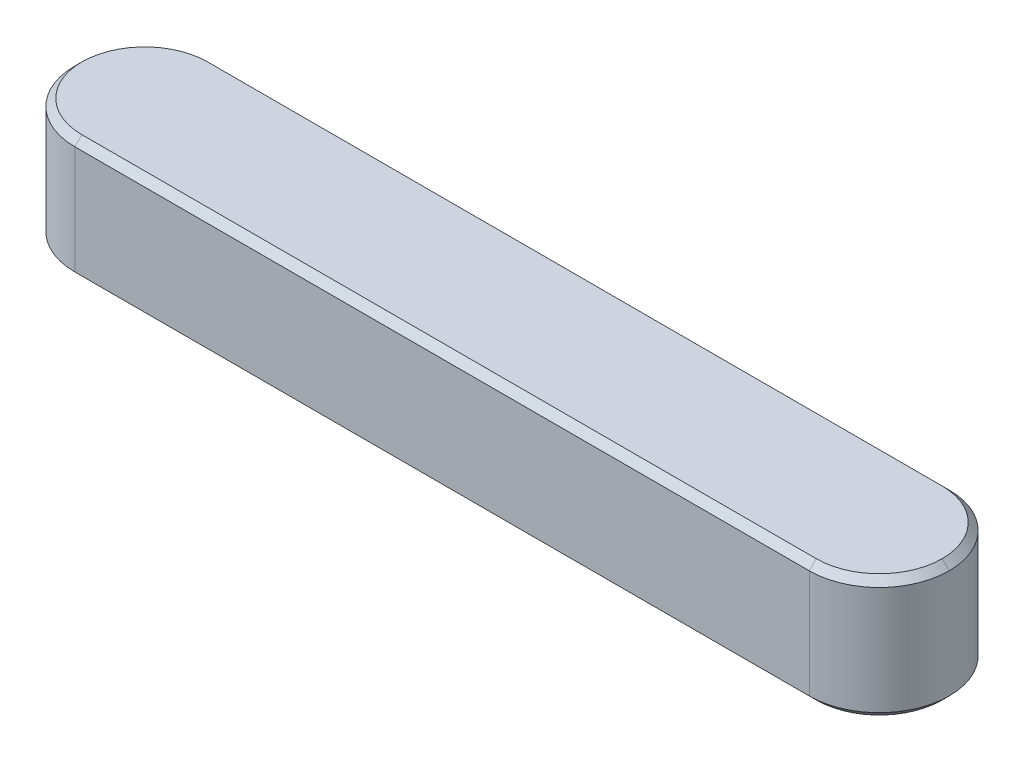
ISO-10303-21;
HEADER;
FILE_DESCRIPTION(('STEP AP214'),'2;1');
FILE_NAME('part.step','',(''),(''),'','','');
FILE_SCHEMA(('AUTOMOTIVE_DESIGN { 1 0 10303 214 1 1 1 1 }'));
ENDSEC;
DATA;
#1=APPLICATION_CONTEXT('core data for automotive mechanical design processes');
#2=APPLICATION_PROTOCOL_DEFINITION('international standard','automotive_design',2000,#1);
#3=PRODUCT_CONTEXT('',#1,'mechanical');
#4=PRODUCT('Part','Part','',(#3));
#5=PRODUCT_RELATED_PRODUCT_CATEGORY('part','',(#4));
#6=PRODUCT_DEFINITION_FORMATION('','',#4);
#7=PRODUCT_DEFINITION_CONTEXT('part definition',#1,'design');
#8=PRODUCT_DEFINITION('design','',#6,#7);
#9=PRODUCT_DEFINITION_SHAPE('','',#8);
#10=(LENGTH_UNIT() NAMED_UNIT(*) SI_UNIT(.MILLI.,.METRE.));
#11=(NAMED_UNIT(*) PLANE_ANGLE_UNIT() SI_UNIT($,.RADIAN.));
#12=(NAMED_UNIT(*) SI_UNIT($,.STERADIAN.) SOLID_ANGLE_UNIT());
#13=UNCERTAINTY_MEASURE_WITH_UNIT(LENGTH_MEASURE(1.E-05),#10,'distance_accuracy_value','');
#14=(GEOMETRIC_REPRESENTATION_CONTEXT(3) GLOBAL_UNCERTAINTY_ASSIGNED_CONTEXT((#13)) GLOBAL_UNIT_ASSIGNED_CONTEXT((#10,
#11,#12)) REPRESENTATION_CONTEXT('',''));
#15=CARTESIAN_POINT('',(0.,0.,0.));
#16=DIRECTION('',(0.,0.,1.));
#17=DIRECTION('',(1.,0.,0.));
#18=AXIS2_PLACEMENT_3D('',#15,#16,#17);
#19=CARTESIAN_POINT('',(149.000005082878,10.,-3.6));
#20=DIRECTION('',(0.,0.707106781186548,0.707106781186548));
#21=DIRECTION('',(-1.,0.,0.));
#22=AXIS2_PLACEMENT_3D('',#19,#20,#21);
#23=PLANE('',#22);
#24=DIRECTION('',(0.,0.707106781186548,-0.707106781186548));
#25=VECTOR('',#24,1.);
#26=CARTESIAN_POINT('',(149.000005082878,10.,-3.6));
#27=LINE('',#26,#25);
#28=CARTESIAN_POINT('',(149.000005082878,10.,-3.6));
#29=VERTEX_POINT('',#28);
#30=CARTESIAN_POINT('',(149.000005082878,10.4,-4.));
#31=VERTEX_POINT('',#30);
#32=EDGE_CURVE('E151',#29,#31,#27,.T.);
#33=ORIENTED_EDGE('',*,*,#32,.T.);
#34=DIRECTION('',(-1.,0.,0.));
#35=VECTOR('',#34,1.);
#36=CARTESIAN_POINT('',(191.000005082878,10.4,-4.));
#37=LINE('',#36,#35);
#38=CARTESIAN_POINT('',(191.000005082878,10.4,-4.));
#39=VERTEX_POINT('',#38);
#40=EDGE_CURVE('E203',#39,#31,#37,.T.);
#41=ORIENTED_EDGE('',*,*,#40,.F.);
#42=DIRECTION('',(0.,-0.707106781186548,0.707106781186548));
#43=VECTOR('',#42,1.);
#44=CARTESIAN_POINT('',(191.000005082878,10.4,-4.));
#45=LINE('',#44,#43);
#46=CARTESIAN_POINT('',(191.000005082878,10.,-3.6));
#47=VERTEX_POINT('',#46);
#48=EDGE_CURVE('E11',#39,#47,#45,.T.);
#49=ORIENTED_EDGE('',*,*,#48,.T.);
#50=DIRECTION('',(1.,0.,0.));
#51=VECTOR('',#50,1.);
#52=CARTESIAN_POINT('',(149.000005082878,10.,-3.6));
#53=LINE('',#52,#51);
#54=EDGE_CURVE('E134',#29,#47,#53,.T.);
#55=ORIENTED_EDGE('',*,*,#54,.F.);
#56=EDGE_LOOP('',(#33,#41,#49,#55));
#57=FACE_BOUND('',#56,.T.);
#58=ADVANCED_FACE('F17',(#57),#23,.F.);
#59=CARTESIAN_POINT('',(191.000005082878,10.,0.));
#60=DIRECTION('',(0.,1.,0.));
#61=DIRECTION('',(-1.,0.,0.));
#62=AXIS2_PLACEMENT_3D('',#59,#60,#61);
#63=CONICAL_SURFACE('',#62,3.6,0.785398163397448);
#64=DIRECTION('',(0.,-0.707106781186548,-0.707106781186548));
#65=VECTOR('',#64,1.);
#66=CARTESIAN_POINT('',(191.000005082878,10.4,4.));
#67=LINE('',#66,#65);
#68=CARTESIAN_POINT('',(191.000005082878,10.4,4.));
#69=VERTEX_POINT('',#68);
#70=CARTESIAN_POINT('',(191.000005082878,10.,3.6));
#71=VERTEX_POINT('',#70);
#72=EDGE_CURVE('E166',#69,#71,#67,.T.);
#73=ORIENTED_EDGE('',*,*,#72,.T.);
#74=CARTESIAN_POINT('',(191.000005082878,10.,0.));
#75=DIRECTION('',(0.,-1.,0.));
#76=DIRECTION('',(-1.,0.,0.));
#77=AXIS2_PLACEMENT_3D('',#74,#75,#76);
#78=CIRCLE('',#77,3.6);
#79=EDGE_CURVE('E232',#47,#71,#78,.T.);
#80=ORIENTED_EDGE('',*,*,#79,.F.);
#81=ORIENTED_EDGE('',*,*,#48,.F.);
#82=CARTESIAN_POINT('',(191.000005082878,10.4,0.));
#83=DIRECTION('',(0.,1.,0.));
#84=DIRECTION('',(-1.,0.,0.));
#85=AXIS2_PLACEMENT_3D('',#82,#83,#84);
#86=CIRCLE('',#85,4.);
#87=EDGE_CURVE('E215',#69,#39,#86,.T.);
#88=ORIENTED_EDGE('',*,*,#87,.F.);
#89=EDGE_LOOP('',(#73,#80,#81,#88));
#90=FACE_BOUND('',#89,.T.);
#91=ADVANCED_FACE('F280',(#90),#63,.T.);
#92=CARTESIAN_POINT('',(149.000005082878,10.,0.));
#93=DIRECTION('',(0.,1.,0.));
#94=DIRECTION('',(-1.,0.,0.));
#95=AXIS2_PLACEMENT_3D('',#92,#93,#94);
#96=CONICAL_SURFACE('',#95,3.6,0.785398163397448);
#97=DIRECTION('',(-0.707106781186548,0.707106781186548,0.));
#98=VECTOR('',#97,1.);
#99=CARTESIAN_POINT('',(145.400005082878,10.,0.));
#100=LINE('',#99,#98);
#101=CARTESIAN_POINT('',(145.400005082878,10.,0.));
#102=VERTEX_POINT('',#101);
#103=CARTESIAN_POINT('',(145.000005082878,10.4,0.));
#104=VERTEX_POINT('',#103);
#105=EDGE_CURVE('E138',#102,#104,#100,.T.);
#106=ORIENTED_EDGE('',*,*,#105,.F.);
#107=CARTESIAN_POINT('',(149.000005082878,10.,0.));
#108=DIRECTION('',(0.,-1.,0.));
#109=DIRECTION('',(-1.,0.,0.));
#110=AXIS2_PLACEMENT_3D('',#107,#108,#109);
#111=CIRCLE('',#110,3.6);
#112=CARTESIAN_POINT('',(149.000005082878,10.,3.6));
#113=VERTEX_POINT('',#112);
#114=EDGE_CURVE('E123',#113,#102,#111,.T.);
#115=ORIENTED_EDGE('',*,*,#114,.F.);
#116=DIRECTION('',(0.,0.707106781186548,0.707106781186548));
#117=VECTOR('',#116,1.);
#118=CARTESIAN_POINT('',(149.000005082878,10.,3.6));
#119=LINE('',#118,#117);
#120=CARTESIAN_POINT('',(149.000005082878,10.4,4.));
#121=VERTEX_POINT('',#120);
#122=EDGE_CURVE('E25',#113,#121,#119,.T.);
#123=ORIENTED_EDGE('',*,*,#122,.T.);
#124=CARTESIAN_POINT('',(149.000005082878,10.4,0.));
#125=DIRECTION('',(0.,1.,0.));
#126=DIRECTION('',(-1.,0.,0.));
#127=AXIS2_PLACEMENT_3D('',#124,#125,#126);
#128=CIRCLE('',#127,4.);
#129=EDGE_CURVE('E141',#104,#121,#128,.T.);
#130=ORIENTED_EDGE('',*,*,#129,.F.);
#131=EDGE_LOOP('',(#106,#115,#123,#130));
#132=FACE_BOUND('',#131,.T.);
#133=ADVANCED_FACE('F139',(#132),#96,.T.);
#134=CARTESIAN_POINT('',(149.000005082878,10.,3.6));
#135=DIRECTION('',(0.,0.707106781186548,-0.707106781186548));
#136=DIRECTION('',(0.,-0.707106781186548,-0.707106781186548));
#137=AXIS2_PLACEMENT_3D('',#134,#135,#136);
#138=PLANE('',#137);
#139=ORIENTED_EDGE('',*,*,#72,.F.);
#140=DIRECTION('',(1.,0.,0.));
#141=VECTOR('',#140,1.);
#142=CARTESIAN_POINT('',(149.000005082878,10.4,4.));
#143=LINE('',#142,#141);
#144=EDGE_CURVE('E223',#121,#69,#143,.T.);
#145=ORIENTED_EDGE('',*,*,#144,.F.);
#146=ORIENTED_EDGE('',*,*,#122,.F.);
#147=DIRECTION('',(-1.,0.,0.));
#148=VECTOR('',#147,1.);
#149=CARTESIAN_POINT('',(149.000005082878,10.,3.6));
#150=LINE('',#149,#148);
#151=EDGE_CURVE('E131',#71,#113,#150,.T.);
#152=ORIENTED_EDGE('',*,*,#151,.F.);
#153=EDGE_LOOP('',(#139,#145,#146,#152));
#154=FACE_BOUND('',#153,.T.);
#155=ADVANCED_FACE('F263',(#154),#138,.F.);
#156=CARTESIAN_POINT('',(191.000005082878,16.6,-4.));
#157=DIRECTION('',(0.,0.707106781186554,-0.707106781186542));
#158=DIRECTION('',(0.,-0.707106781186542,-0.707106781186554));
#159=AXIS2_PLACEMENT_3D('',#156,#157,#158);
#160=PLANE('',#159);
#161=DIRECTION('',(0.,0.707106781186548,0.707106781186548));
#162=VECTOR('',#161,1.);
#163=CARTESIAN_POINT('',(149.000005082878,16.6,-4.));
#164=LINE('',#163,#162);
#165=CARTESIAN_POINT('',(149.000005082878,16.6,-4.));
#166=VERTEX_POINT('',#165);
#167=CARTESIAN_POINT('',(149.000005082878,17.,-3.6));
#168=VERTEX_POINT('',#167);
#169=EDGE_CURVE('E46',#166,#168,#164,.T.);
#170=ORIENTED_EDGE('',*,*,#169,.T.);
#171=DIRECTION('',(-1.,0.,0.));
#172=VECTOR('',#171,1.);
#173=CARTESIAN_POINT('',(149.000005082878,17.,-3.6));
#174=LINE('',#173,#172);
#175=CARTESIAN_POINT('',(191.000005082878,17.,-3.6));
#176=VERTEX_POINT('',#175);
#177=EDGE_CURVE('E240',#176,#168,#174,.T.);
#178=ORIENTED_EDGE('',*,*,#177,.F.);
#179=DIRECTION('',(0.,-0.707106781186548,-0.707106781186548));
#180=VECTOR('',#179,1.);
#181=CARTESIAN_POINT('',(191.000005082878,17.,-3.6));
#182=LINE('',#181,#180);
#183=CARTESIAN_POINT('',(191.000005082878,16.6,-4.));
#184=VERTEX_POINT('',#183);
#185=EDGE_CURVE('E184',#176,#184,#182,.T.);
#186=ORIENTED_EDGE('',*,*,#185,.T.);
#187=DIRECTION('',(1.,0.,0.));
#188=VECTOR('',#187,1.);
#189=CARTESIAN_POINT('',(191.000005082878,16.6,-4.));
#190=LINE('',#189,#188);
#191=EDGE_CURVE('E163',#166,#184,#190,.T.);
#192=ORIENTED_EDGE('',*,*,#191,.F.);
#193=EDGE_LOOP('',(#170,#178,#186,#192));
#194=FACE_BOUND('',#193,.T.);
#195=ADVANCED_FACE('F295',(#194),#160,.T.);
#196=CARTESIAN_POINT('',(191.000005082878,16.6,0.));
#197=DIRECTION('',(0.,-1.,0.));
#198=DIRECTION('',(1.,0.,0.));
#199=AXIS2_PLACEMENT_3D('',#196,#197,#198);
#200=CONICAL_SURFACE('',#199,4.,0.785398163397448);
#201=DIRECTION('',(0.707106781186548,-0.707106781186548,0.));
#202=VECTOR('',#201,1.);
#203=CARTESIAN_POINT('',(195.000005082878,16.6,0.));
#204=LINE('',#203,#202);
#205=CARTESIAN_POINT('',(194.600005082878,17.,0.));
#206=VERTEX_POINT('',#205);
#207=CARTESIAN_POINT('',(195.000005082878,16.6,0.));
#208=VERTEX_POINT('',#207);
#209=EDGE_CURVE('E176',#206,#208,#204,.T.);
#210=ORIENTED_EDGE('',*,*,#209,.F.);
#211=CARTESIAN_POINT('',(191.000005082878,17.,0.));
#212=DIRECTION('',(0.,1.,0.));
#213=DIRECTION('',(-1.,0.,0.));
#214=AXIS2_PLACEMENT_3D('',#211,#212,#213);
#215=CIRCLE('',#214,3.6);
#216=CARTESIAN_POINT('',(191.000005082878,17.,3.6));
#217=VERTEX_POINT('',#216);
#218=EDGE_CURVE('E237',#217,#206,#215,.T.);
#219=ORIENTED_EDGE('',*,*,#218,.F.);
#220=DIRECTION('',(0.,-0.707106781186548,0.707106781186548));
#221=VECTOR('',#220,1.);
#222=CARTESIAN_POINT('',(191.000005082878,17.,3.6));
#223=LINE('',#222,#221);
#224=CARTESIAN_POINT('',(191.000005082878,16.6,4.));
#225=VERTEX_POINT('',#224);
#226=EDGE_CURVE('E252',#217,#225,#223,.T.);
#227=ORIENTED_EDGE('',*,*,#226,.T.);
#228=CARTESIAN_POINT('',(191.000005082878,16.6,0.));
#229=DIRECTION('',(0.,-1.,0.));
#230=DIRECTION('',(-1.,0.,0.));
#231=AXIS2_PLACEMENT_3D('',#228,#229,#230);
#232=CIRCLE('',#231,4.);
#233=EDGE_CURVE('E219',#208,#225,#232,.T.);
#234=ORIENTED_EDGE('',*,*,#233,.F.);
#235=EDGE_LOOP('',(#210,#219,#227,#234));
#236=FACE_BOUND('',#235,.T.);
#237=ADVANCED_FACE('F287',(#236),#200,.T.);
#238=CARTESIAN_POINT('',(149.000005082878,16.6,0.));
#239=DIRECTION('',(0.,-1.,0.));
#240=DIRECTION('',(1.,0.,0.));
#241=AXIS2_PLACEMENT_3D('',#238,#239,#240);
#242=CONICAL_SURFACE('',#241,4.,0.785398163397448);
#243=DIRECTION('',(0.,0.707106781186548,-0.707106781186548));
#244=VECTOR('',#243,1.);
#245=CARTESIAN_POINT('',(149.000005082878,16.6,4.));
#246=LINE('',#245,#244);
#247=CARTESIAN_POINT('',(149.000005082878,16.6,4.));
#248=VERTEX_POINT('',#247);
#249=CARTESIAN_POINT('',(149.000005082878,17.,3.6));
#250=VERTEX_POINT('',#249);
#251=EDGE_CURVE('E36',#248,#250,#246,.T.);
#252=ORIENTED_EDGE('',*,*,#251,.T.);
#253=CARTESIAN_POINT('',(149.000005082878,17.,0.));
#254=DIRECTION('',(0.,1.,0.));
#255=DIRECTION('',(-1.,0.,0.));
#256=AXIS2_PLACEMENT_3D('',#253,#254,#255);
#257=CIRCLE('',#256,3.6);
#258=EDGE_CURVE('E244',#168,#250,#257,.T.);
#259=ORIENTED_EDGE('',*,*,#258,.F.);
#260=ORIENTED_EDGE('',*,*,#169,.F.);
#261=CARTESIAN_POINT('',(149.000005082878,16.6,0.));
#262=DIRECTION('',(0.,-1.,0.));
#263=DIRECTION('',(-1.,0.,0.));
#264=AXIS2_PLACEMENT_3D('',#261,#262,#263);
#265=CIRCLE('',#264,4.);
#266=CARTESIAN_POINT('',(145.000005082878,16.6,0.));
#267=VERTEX_POINT('',#266);
#268=EDGE_CURVE('E192',#267,#166,#265,.T.);
#269=ORIENTED_EDGE('',*,*,#268,.F.);
#270=CARTESIAN_POINT('',(149.000005082878,16.6,0.));
#271=DIRECTION('',(0.,-1.,0.));
#272=DIRECTION('',(-1.,0.,0.));
#273=AXIS2_PLACEMENT_3D('',#270,#271,#272);
#274=CIRCLE('',#273,4.);
#275=EDGE_CURVE('E159',#248,#267,#274,.T.);
#276=ORIENTED_EDGE('',*,*,#275,.F.);
#277=EDGE_LOOP('',(#252,#259,#260,#269,#276));
#278=FACE_BOUND('',#277,.T.);
#279=ADVANCED_FACE('F294',(#278),#242,.T.);
#280=CARTESIAN_POINT('',(149.000005082878,16.6,4.));
#281=DIRECTION('',(0.,0.707106781186548,0.707106781186548));
#282=DIRECTION('',(-1.,0.,0.));
#283=AXIS2_PLACEMENT_3D('',#280,#281,#282);
#284=PLANE('',#283);
#285=ORIENTED_EDGE('',*,*,#226,.F.);
#286=DIRECTION('',(1.,0.,0.));
#287=VECTOR('',#286,1.);
#288=CARTESIAN_POINT('',(191.000005082878,17.,3.6));
#289=LINE('',#288,#287);
#290=EDGE_CURVE('E248',#250,#217,#289,.T.);
#291=ORIENTED_EDGE('',*,*,#290,.F.);
#292=ORIENTED_EDGE('',*,*,#251,.F.);
#293=DIRECTION('',(-1.,0.,0.));
#294=VECTOR('',#293,1.);
#295=CARTESIAN_POINT('',(149.000005082878,16.6,4.));
#296=LINE('',#295,#294);
#297=EDGE_CURVE('E135',#225,#248,#296,.T.);
#298=ORIENTED_EDGE('',*,*,#297,.F.);
#299=EDGE_LOOP('',(#285,#291,#292,#298));
#300=FACE_BOUND('',#299,.T.);
#301=ADVANCED_FACE('F291',(#300),#284,.T.);
#302=CARTESIAN_POINT('',(149.000005082878,17.,0.));
#303=DIRECTION('',(0.,1.,0.));
#304=DIRECTION('',(0.,0.,-1.));
#305=AXIS2_PLACEMENT_3D('',#302,#303,#304);
#306=PLANE('',#305);
#307=ORIENTED_EDGE('',*,*,#218,.T.);
#308=CARTESIAN_POINT('',(191.000005082878,17.,0.));
#309=DIRECTION('',(0.,1.,0.));
#310=DIRECTION('',(-1.,0.,0.));
#311=AXIS2_PLACEMENT_3D('',#308,#309,#310);
#312=CIRCLE('',#311,3.6);
#313=EDGE_CURVE('E172',#206,#176,#312,.T.);
#314=ORIENTED_EDGE('',*,*,#313,.T.);
#315=ORIENTED_EDGE('',*,*,#177,.T.);
#316=ORIENTED_EDGE('',*,*,#258,.T.);
#317=ORIENTED_EDGE('',*,*,#290,.T.);
#318=EDGE_LOOP('',(#307,#314,#315,#316,#317));
#319=FACE_BOUND('',#318,.T.);
#320=ADVANCED_FACE('F293',(#319),#306,.T.);
#321=CARTESIAN_POINT('',(149.000005082878,10.,0.));
#322=DIRECTION('',(0.,1.,0.));
#323=DIRECTION('',(0.,0.,-1.));
#324=AXIS2_PLACEMENT_3D('',#321,#322,#323);
#325=PLANE('',#324);
#326=ORIENTED_EDGE('',*,*,#114,.T.);
#327=CARTESIAN_POINT('',(149.000005082878,10.,0.));
#328=DIRECTION('',(0.,-1.,0.));
#329=DIRECTION('',(-1.,0.,0.));
#330=AXIS2_PLACEMENT_3D('',#327,#328,#329);
#331=CIRCLE('',#330,3.6);
#332=EDGE_CURVE('E128',#102,#29,#331,.T.);
#333=ORIENTED_EDGE('',*,*,#332,.T.);
#334=ORIENTED_EDGE('',*,*,#54,.T.);
#335=ORIENTED_EDGE('',*,*,#79,.T.);
#336=ORIENTED_EDGE('',*,*,#151,.T.);
#337=EDGE_LOOP('',(#326,#333,#334,#335,#336));
#338=FACE_BOUND('',#337,.T.);
#339=ADVANCED_FACE('F125',(#338),#325,.F.);
#340=CARTESIAN_POINT('',(149.000005082878,10.,4.));
#341=DIRECTION('',(0.,0.,-1.));
#342=DIRECTION('',(0.,1.,0.));
#343=AXIS2_PLACEMENT_3D('',#340,#341,#342);
#344=PLANE('',#343);
#345=DIRECTION('',(0.,1.,0.));
#346=VECTOR('',#345,1.);
#347=CARTESIAN_POINT('',(149.000005082878,10.,4.));
#348=LINE('',#347,#346);
#349=EDGE_CURVE('E157',#121,#248,#348,.T.);
#350=ORIENTED_EDGE('',*,*,#349,.F.);
#351=ORIENTED_EDGE('',*,*,#144,.T.);
#352=DIRECTION('',(0.,1.,0.));
#353=VECTOR('',#352,1.);
#354=CARTESIAN_POINT('',(191.000005082878,10.,4.));
#355=LINE('',#354,#353);
#356=EDGE_CURVE('E211',#69,#225,#355,.T.);
#357=ORIENTED_EDGE('',*,*,#356,.T.);
#358=ORIENTED_EDGE('',*,*,#297,.T.);
#359=EDGE_LOOP('',(#350,#351,#357,#358));
#360=FACE_BOUND('',#359,.T.);
#361=ADVANCED_FACE('F266',(#360),#344,.F.);
#362=CARTESIAN_POINT('',(191.000005082878,10.,0.));
#363=DIRECTION('',(0.,1.,0.));
#364=DIRECTION('',(-1.,0.,0.));
#365=AXIS2_PLACEMENT_3D('',#362,#363,#364);
#366=CYLINDRICAL_SURFACE('',#365,4.);
#367=ORIENTED_EDGE('',*,*,#356,.F.);
#368=ORIENTED_EDGE('',*,*,#87,.T.);
#369=DIRECTION('',(0.,1.,0.));
#370=VECTOR('',#369,1.);
#371=CARTESIAN_POINT('',(191.000005082878,10.,-4.));
#372=LINE('',#371,#370);
#373=EDGE_CURVE('E200',#39,#184,#372,.T.);
#374=ORIENTED_EDGE('',*,*,#373,.T.);
#375=CARTESIAN_POINT('',(191.000005082878,16.6,0.));
#376=DIRECTION('',(0.,-1.,0.));
#377=DIRECTION('',(-1.,0.,0.));
#378=AXIS2_PLACEMENT_3D('',#375,#376,#377);
#379=CIRCLE('',#378,4.);
#380=EDGE_CURVE('E180',#184,#208,#379,.T.);
#381=ORIENTED_EDGE('',*,*,#380,.T.);
#382=ORIENTED_EDGE('',*,*,#233,.T.);
#383=EDGE_LOOP('',(#367,#368,#374,#381,#382));
#384=FACE_BOUND('',#383,.T.);
#385=ADVANCED_FACE('F283',(#384),#366,.T.);
#386=CARTESIAN_POINT('',(191.000005082878,10.,-4.));
#387=DIRECTION('',(0.,0.,1.));
#388=DIRECTION('',(1.,0.,0.));
#389=AXIS2_PLACEMENT_3D('',#386,#387,#388);
#390=PLANE('',#389);
#391=DIRECTION('',(0.,1.,0.));
#392=VECTOR('',#391,1.);
#393=CARTESIAN_POINT('',(149.000005082878,10.,-4.));
#394=LINE('',#393,#392);
#395=EDGE_CURVE('E196',#31,#166,#394,.T.);
#396=ORIENTED_EDGE('',*,*,#395,.T.);
#397=ORIENTED_EDGE('',*,*,#191,.T.);
#398=ORIENTED_EDGE('',*,*,#373,.F.);
#399=ORIENTED_EDGE('',*,*,#40,.T.);
#400=EDGE_LOOP('',(#396,#397,#398,#399));
#401=FACE_BOUND('',#400,.T.);
#402=ADVANCED_FACE('F297',(#401),#390,.F.);
#403=CARTESIAN_POINT('',(149.000005082878,10.,0.));
#404=DIRECTION('',(0.,1.,0.));
#405=DIRECTION('',(-1.,0.,0.));
#406=AXIS2_PLACEMENT_3D('',#403,#404,#405);
#407=CYLINDRICAL_SURFACE('',#406,4.);
#408=DIRECTION('',(0.,1.,0.));
#409=VECTOR('',#408,1.);
#410=CARTESIAN_POINT('',(145.000005082878,10.,0.));
#411=LINE('',#410,#409);
#412=EDGE_CURVE('E188',#104,#267,#411,.T.);
#413=ORIENTED_EDGE('',*,*,#412,.F.);
#414=ORIENTED_EDGE('',*,*,#129,.T.);
#415=ORIENTED_EDGE('',*,*,#349,.T.);
#416=ORIENTED_EDGE('',*,*,#275,.T.);
#417=EDGE_LOOP('',(#413,#414,#415,#416));
#418=FACE_BOUND('',#417,.T.);
#419=ADVANCED_FACE('F269',(#418),#407,.T.);
#420=CARTESIAN_POINT('',(149.000005082878,10.,0.));
#421=DIRECTION('',(0.,1.,0.));
#422=DIRECTION('',(-1.,0.,0.));
#423=AXIS2_PLACEMENT_3D('',#420,#421,#422);
#424=CYLINDRICAL_SURFACE('',#423,4.);
#425=CARTESIAN_POINT('',(149.000005082878,10.4,0.));
#426=DIRECTION('',(0.,1.,0.));
#427=DIRECTION('',(-1.,0.,0.));
#428=AXIS2_PLACEMENT_3D('',#425,#426,#427);
#429=CIRCLE('',#428,4.);
#430=EDGE_CURVE('E146',#31,#104,#429,.T.);
#431=ORIENTED_EDGE('',*,*,#430,.T.);
#432=ORIENTED_EDGE('',*,*,#412,.T.);
#433=ORIENTED_EDGE('',*,*,#268,.T.);
#434=ORIENTED_EDGE('',*,*,#395,.F.);
#435=EDGE_LOOP('',(#431,#432,#433,#434));
#436=FACE_BOUND('',#435,.T.);
#437=ADVANCED_FACE('F273',(#436),#424,.T.);
#438=CARTESIAN_POINT('',(191.000005082878,16.6,0.));
#439=DIRECTION('',(0.,-1.,0.));
#440=DIRECTION('',(1.,0.,0.));
#441=AXIS2_PLACEMENT_3D('',#438,#439,#440);
#442=CONICAL_SURFACE('',#441,4.,0.785398163397448);
#443=ORIENTED_EDGE('',*,*,#313,.F.);
#444=ORIENTED_EDGE('',*,*,#209,.T.);
#445=ORIENTED_EDGE('',*,*,#380,.F.);
#446=ORIENTED_EDGE('',*,*,#185,.F.);
#447=EDGE_LOOP('',(#443,#444,#445,#446));
#448=FACE_BOUND('',#447,.T.);
#449=ADVANCED_FACE('F362',(#448),#442,.T.);
#450=CARTESIAN_POINT('',(149.000005082878,10.,0.));
#451=DIRECTION('',(0.,1.,0.));
#452=DIRECTION('',(-1.,0.,0.));
#453=AXIS2_PLACEMENT_3D('',#450,#451,#452);
#454=CONICAL_SURFACE('',#453,3.6,0.785398163397448);
#455=ORIENTED_EDGE('',*,*,#332,.F.);
#456=ORIENTED_EDGE('',*,*,#105,.T.);
#457=ORIENTED_EDGE('',*,*,#430,.F.);
#458=ORIENTED_EDGE('',*,*,#32,.F.);
#459=EDGE_LOOP('',(#455,#456,#457,#458));
#460=FACE_BOUND('',#459,.T.);
#461=ADVANCED_FACE('F149',(#460),#454,.T.);
#462=CLOSED_SHELL('',(#58,#91,#133,#155,#195,#237,#279,#301,#320,#339,#361,#385,#402,#419,#437,
#449,#461));
#463=MANIFOLD_SOLID_BREP('B1',#462);
#464=ADVANCED_BREP_SHAPE_REPRESENTATION('',(#18,#463),#14);
#465=SHAPE_DEFINITION_REPRESENTATION(#9,#464);
ENDSEC;
END-ISO-10303-21;
